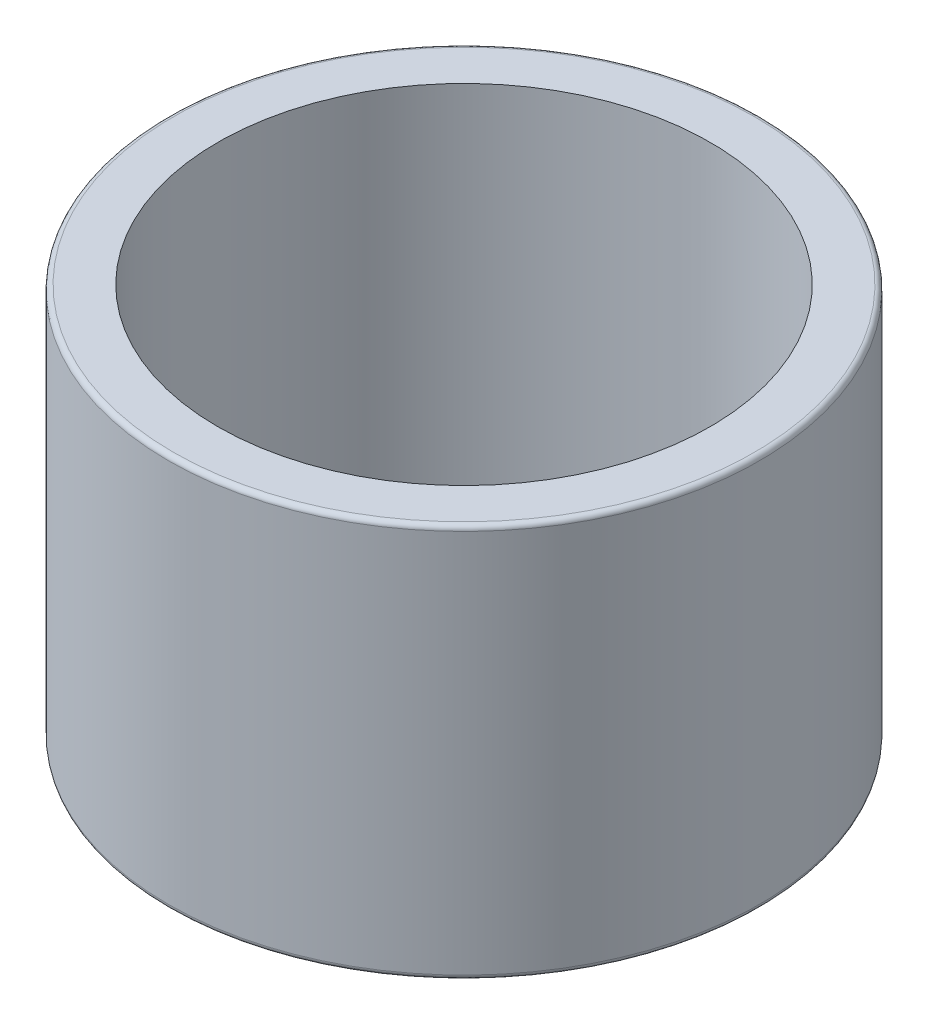
ISO-10303-21;
HEADER;
FILE_DESCRIPTION(('STEP AP214'),'2;1');
FILE_NAME('part.step','',(''),(''),'','','');
FILE_SCHEMA(('AUTOMOTIVE_DESIGN { 1 0 10303 214 1 1 1 1 }'));
ENDSEC;
DATA;
#1=APPLICATION_CONTEXT('core data for automotive mechanical design processes');
#2=APPLICATION_PROTOCOL_DEFINITION('international standard','automotive_design',2000,#1);
#3=PRODUCT_CONTEXT('',#1,'mechanical');
#4=PRODUCT('Part','Part','',(#3));
#5=PRODUCT_RELATED_PRODUCT_CATEGORY('part','',(#4));
#6=PRODUCT_DEFINITION_FORMATION('','',#4);
#7=PRODUCT_DEFINITION_CONTEXT('part definition',#1,'design');
#8=PRODUCT_DEFINITION('design','',#6,#7);
#9=PRODUCT_DEFINITION_SHAPE('','',#8);
#10=(LENGTH_UNIT() NAMED_UNIT(*) SI_UNIT(.MILLI.,.METRE.));
#11=(NAMED_UNIT(*) PLANE_ANGLE_UNIT() SI_UNIT($,.RADIAN.));
#12=(NAMED_UNIT(*) SI_UNIT($,.STERADIAN.) SOLID_ANGLE_UNIT());
#13=UNCERTAINTY_MEASURE_WITH_UNIT(LENGTH_MEASURE(1.E-05),#10,'distance_accuracy_value','');
#14=(GEOMETRIC_REPRESENTATION_CONTEXT(3) GLOBAL_UNCERTAINTY_ASSIGNED_CONTEXT((#13)) GLOBAL_UNIT_ASSIGNED_CONTEXT((#10,
#11,#12)) REPRESENTATION_CONTEXT('',''));
#15=CARTESIAN_POINT('',(0.,0.,0.));
#16=DIRECTION('',(0.,0.,1.));
#17=DIRECTION('',(1.,0.,0.));
#18=AXIS2_PLACEMENT_3D('',#15,#16,#17);
#19=CARTESIAN_POINT('',(0.,4.,0.));
#20=DIRECTION('',(0.,1.,0.));
#21=DIRECTION('',(0.,0.,1.));
#22=AXIS2_PLACEMENT_3D('',#19,#20,#21);
#23=PLANE('',#22);
#24=CARTESIAN_POINT('',(0.,4.,0.));
#25=DIRECTION('',(0.,1.,0.));
#26=DIRECTION('',(0.,0.,1.));
#27=AXIS2_PLACEMENT_3D('',#24,#25,#26);
#28=CIRCLE('',#27,5.9);
#29=CARTESIAN_POINT('',(0.,4.,5.9));
#30=VERTEX_POINT('',#29);
#31=EDGE_CURVE('E10',#30,#30,#28,.T.);
#32=ORIENTED_EDGE('',*,*,#31,.T.);
#33=EDGE_LOOP('',(#32));
#34=FACE_BOUND('',#33,.T.);
#35=CARTESIAN_POINT('',(0.,4.,0.));
#36=DIRECTION('',(0.,1.,0.));
#37=DIRECTION('',(0.,0.,1.));
#38=AXIS2_PLACEMENT_3D('',#35,#36,#37);
#39=CIRCLE('',#38,5.);
#40=CARTESIAN_POINT('',(0.,4.,5.));
#41=VERTEX_POINT('',#40);
#42=EDGE_CURVE('E53',#41,#41,#39,.T.);
#43=ORIENTED_EDGE('',*,*,#42,.F.);
#44=EDGE_LOOP('',(#43));
#45=FACE_BOUND('',#44,.T.);
#46=ADVANCED_FACE('F33',(#34,#45),#23,.T.);
#47=CARTESIAN_POINT('',(0.,-4.,0.));
#48=DIRECTION('',(0.,1.,0.));
#49=DIRECTION('',(0.,0.,1.));
#50=AXIS2_PLACEMENT_3D('',#47,#48,#49);
#51=PLANE('',#50);
#52=CARTESIAN_POINT('',(0.,-4.,0.));
#53=DIRECTION('',(0.,1.,0.));
#54=DIRECTION('',(0.,0.,1.));
#55=AXIS2_PLACEMENT_3D('',#52,#53,#54);
#56=CIRCLE('',#55,5.9);
#57=CARTESIAN_POINT('',(0.,-4.,5.9));
#58=VERTEX_POINT('',#57);
#59=EDGE_CURVE('E40',#58,#58,#56,.F.);
#60=ORIENTED_EDGE('',*,*,#59,.T.);
#61=EDGE_LOOP('',(#60));
#62=FACE_BOUND('',#61,.T.);
#63=CARTESIAN_POINT('',(0.,-4.,0.));
#64=DIRECTION('',(0.,1.,0.));
#65=DIRECTION('',(0.,0.,1.));
#66=AXIS2_PLACEMENT_3D('',#63,#64,#65);
#67=CIRCLE('',#66,5.);
#68=CARTESIAN_POINT('',(0.,-4.,5.));
#69=VERTEX_POINT('',#68);
#70=EDGE_CURVE('E54',#69,#69,#67,.T.);
#71=ORIENTED_EDGE('',*,*,#70,.T.);
#72=EDGE_LOOP('',(#71));
#73=FACE_BOUND('',#72,.T.);
#74=ADVANCED_FACE('F64',(#62,#73),#51,.F.);
#75=CARTESIAN_POINT('',(0.,4.,0.));
#76=DIRECTION('',(0.,-1.,0.));
#77=DIRECTION('',(0.,0.,-1.));
#78=AXIS2_PLACEMENT_3D('',#75,#76,#77);
#79=CYLINDRICAL_SURFACE('',#78,6.);
#80=CARTESIAN_POINT('',(0.,-3.9,0.));
#81=DIRECTION('',(0.,1.,0.));
#82=DIRECTION('',(0.,0.,1.));
#83=AXIS2_PLACEMENT_3D('',#80,#81,#82);
#84=CIRCLE('',#83,6.);
#85=CARTESIAN_POINT('',(0.,-3.9,6.));
#86=VERTEX_POINT('',#85);
#87=EDGE_CURVE('E44',#86,#86,#84,.T.);
#88=ORIENTED_EDGE('',*,*,#87,.T.);
#89=EDGE_LOOP('',(#88));
#90=FACE_BOUND('',#89,.T.);
#91=CARTESIAN_POINT('',(0.,3.9,0.));
#92=DIRECTION('',(0.,1.,0.));
#93=DIRECTION('',(0.,0.,1.));
#94=AXIS2_PLACEMENT_3D('',#91,#92,#93);
#95=CIRCLE('',#94,6.);
#96=CARTESIAN_POINT('',(0.,3.9,6.));
#97=VERTEX_POINT('',#96);
#98=EDGE_CURVE('E48',#97,#97,#95,.F.);
#99=ORIENTED_EDGE('',*,*,#98,.T.);
#100=EDGE_LOOP('',(#99));
#101=FACE_BOUND('',#100,.T.);
#102=ADVANCED_FACE('F69',(#90,#101),#79,.T.);
#103=CARTESIAN_POINT('',(0.,4.,0.));
#104=DIRECTION('',(0.,-1.,0.));
#105=DIRECTION('',(0.,0.,-1.));
#106=AXIS2_PLACEMENT_3D('',#103,#104,#105);
#107=CYLINDRICAL_SURFACE('',#106,5.);
#108=ORIENTED_EDGE('',*,*,#42,.T.);
#109=EDGE_LOOP('',(#108));
#110=FACE_BOUND('',#109,.T.);
#111=ORIENTED_EDGE('',*,*,#70,.F.);
#112=EDGE_LOOP('',(#111));
#113=FACE_BOUND('',#112,.T.);
#114=ADVANCED_FACE('F60',(#110,#113),#107,.F.);
#115=CARTESIAN_POINT('',(0.,-3.9,0.));
#116=DIRECTION('',(0.,1.,0.));
#117=DIRECTION('',(0.,0.,1.));
#118=AXIS2_PLACEMENT_3D('',#115,#116,#117);
#119=TOROIDAL_SURFACE('',#118,5.9,0.1);
#120=ORIENTED_EDGE('',*,*,#59,.F.);
#121=EDGE_LOOP('',(#120));
#122=FACE_BOUND('',#121,.T.);
#123=ORIENTED_EDGE('',*,*,#87,.F.);
#124=EDGE_LOOP('',(#123));
#125=FACE_BOUND('',#124,.T.);
#126=ADVANCED_FACE('F75',(#122,#125),#119,.T.);
#127=CARTESIAN_POINT('',(0.,3.9,0.));
#128=DIRECTION('',(0.,1.,0.));
#129=DIRECTION('',(0.,0.,1.));
#130=AXIS2_PLACEMENT_3D('',#127,#128,#129);
#131=TOROIDAL_SURFACE('',#130,5.9,0.1);
#132=ORIENTED_EDGE('',*,*,#98,.F.);
#133=EDGE_LOOP('',(#132));
#134=FACE_BOUND('',#133,.T.);
#135=ORIENTED_EDGE('',*,*,#31,.F.);
#136=EDGE_LOOP('',(#135));
#137=FACE_BOUND('',#136,.T.);
#138=ADVANCED_FACE('F35',(#134,#137),#131,.T.);
#139=CLOSED_SHELL('',(#46,#74,#102,#114,#126,#138));
#140=MANIFOLD_SOLID_BREP('B2',#139);
#141=ADVANCED_BREP_SHAPE_REPRESENTATION('',(#18,#140),#14);
#142=SHAPE_DEFINITION_REPRESENTATION(#9,#141);
ENDSEC;
END-ISO-10303-21;
